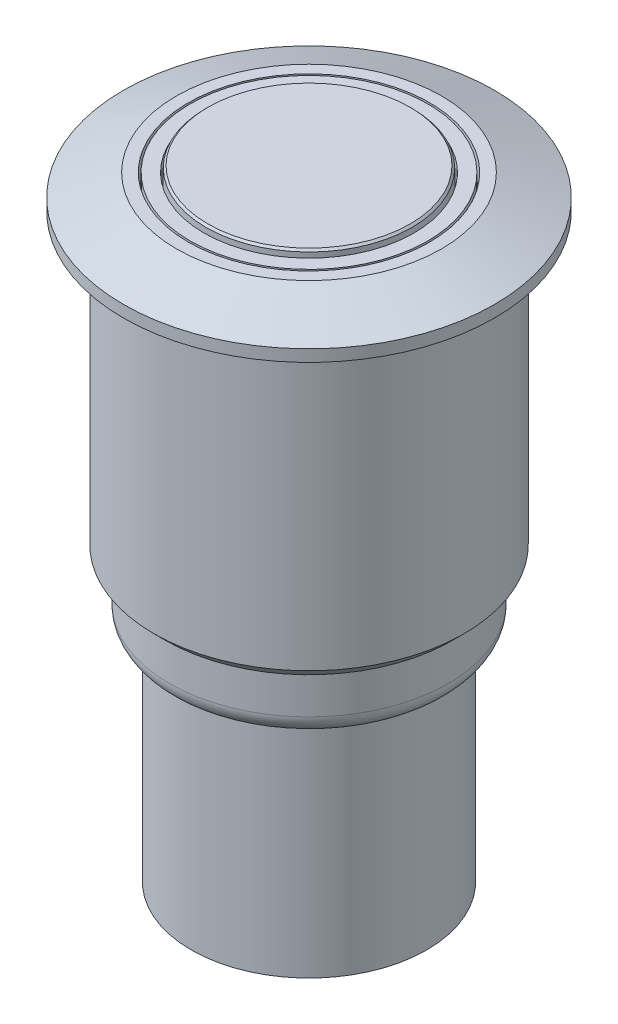
ISO-10303-21;
HEADER;
FILE_DESCRIPTION(('STEP AP214'),'2;1');
FILE_NAME('part.step','',(''),(''),'','','');
FILE_SCHEMA(('AUTOMOTIVE_DESIGN { 1 0 10303 214 1 1 1 1 }'));
ENDSEC;
DATA;
#1=APPLICATION_CONTEXT('core data for automotive mechanical design processes');
#2=APPLICATION_PROTOCOL_DEFINITION('international standard','automotive_design',2000,#1);
#3=PRODUCT_CONTEXT('',#1,'mechanical');
#4=PRODUCT('Part','Part','',(#3));
#5=PRODUCT_RELATED_PRODUCT_CATEGORY('part','',(#4));
#6=PRODUCT_DEFINITION_FORMATION('','',#4);
#7=PRODUCT_DEFINITION_CONTEXT('part definition',#1,'design');
#8=PRODUCT_DEFINITION('design','',#6,#7);
#9=PRODUCT_DEFINITION_SHAPE('','',#8);
#10=(LENGTH_UNIT() NAMED_UNIT(*) SI_UNIT(.MILLI.,.METRE.));
#11=(NAMED_UNIT(*) PLANE_ANGLE_UNIT() SI_UNIT($,.RADIAN.));
#12=(NAMED_UNIT(*) SI_UNIT($,.STERADIAN.) SOLID_ANGLE_UNIT());
#13=UNCERTAINTY_MEASURE_WITH_UNIT(LENGTH_MEASURE(1.E-05),#10,'distance_accuracy_value','');
#14=(GEOMETRIC_REPRESENTATION_CONTEXT(3) GLOBAL_UNCERTAINTY_ASSIGNED_CONTEXT((#13)) GLOBAL_UNIT_ASSIGNED_CONTEXT((#10,
#11,#12)) REPRESENTATION_CONTEXT('',''));
#15=CARTESIAN_POINT('',(0.,0.,0.));
#16=DIRECTION('',(0.,0.,1.));
#17=DIRECTION('',(1.,0.,0.));
#18=AXIS2_PLACEMENT_3D('',#15,#16,#17);
#19=CARTESIAN_POINT('',(0.,2.,0.));
#20=DIRECTION('',(0.,1.,0.));
#21=DIRECTION('',(0.,0.,1.));
#22=AXIS2_PLACEMENT_3D('',#19,#20,#21);
#23=PLANE('',#22);
#24=CARTESIAN_POINT('',(0.,2.00000000000955,0.));
#25=DIRECTION('',(0.,-1.,0.));
#26=DIRECTION('',(1.,0.,0.));
#27=AXIS2_PLACEMENT_3D('',#24,#25,#26);
#28=CIRCLE('',#27,5.15000000007149);
#29=CARTESIAN_POINT('',(5.15000000007149,2.00000000000955,0.));
#30=VERTEX_POINT('',#29);
#31=EDGE_CURVE('E17',#30,#30,#28,.T.);
#32=ORIENTED_EDGE('',*,*,#31,.F.);
#33=EDGE_LOOP('',(#32));
#34=FACE_BOUND('',#33,.T.);
#35=ADVANCED_FACE('F14',(#34),#23,.T.);
#36=CARTESIAN_POINT('',(0.,1.90000000003465,0.));
#37=DIRECTION('',(0.,-1.,0.));
#38=DIRECTION('',(1.,0.,0.));
#39=AXIS2_PLACEMENT_3D('',#36,#37,#38);
#40=CONICAL_SURFACE('',#39,5.24999999998954,0.785398163113231);
#41=ORIENTED_EDGE('',*,*,#31,.T.);
#42=EDGE_LOOP('',(#41));
#43=FACE_BOUND('',#42,.T.);
#44=CARTESIAN_POINT('',(0.,1.90000000000001,0.));
#45=DIRECTION('',(0.,1.,0.));
#46=DIRECTION('',(0.,0.,1.));
#47=AXIS2_PLACEMENT_3D('',#44,#45,#46);
#48=CIRCLE('',#47,5.25);
#49=CARTESIAN_POINT('',(0.,1.90000000000001,5.25));
#50=VERTEX_POINT('',#49);
#51=EDGE_CURVE('E77',#50,#50,#48,.F.);
#52=ORIENTED_EDGE('',*,*,#51,.F.);
#53=EDGE_LOOP('',(#52));
#54=FACE_BOUND('',#53,.T.);
#55=ADVANCED_FACE('F164',(#43,#54),#40,.T.);
#56=CARTESIAN_POINT('',(0.,1.7,0.));
#57=DIRECTION('',(0.,1.,0.));
#58=DIRECTION('',(0.,0.,1.));
#59=AXIS2_PLACEMENT_3D('',#56,#57,#58);
#60=CYLINDRICAL_SURFACE('',#59,5.25);
#61=CARTESIAN_POINT('',(0.,0.6,0.));
#62=DIRECTION('',(0.,1.,0.));
#63=DIRECTION('',(0.,0.,1.));
#64=AXIS2_PLACEMENT_3D('',#61,#62,#63);
#65=CIRCLE('',#64,5.25);
#66=CARTESIAN_POINT('',(0.,0.6,5.25));
#67=VERTEX_POINT('',#66);
#68=EDGE_CURVE('E75',#67,#67,#65,.T.);
#69=ORIENTED_EDGE('',*,*,#68,.T.);
#70=EDGE_LOOP('',(#69));
#71=FACE_BOUND('',#70,.T.);
#72=ORIENTED_EDGE('',*,*,#51,.T.);
#73=EDGE_LOOP('',(#72));
#74=FACE_BOUND('',#73,.T.);
#75=ADVANCED_FACE('F161',(#71,#74),#60,.T.);
#76=CARTESIAN_POINT('',(0.,0.6,5.35));
#77=DIRECTION('',(0.,-1.,0.));
#78=DIRECTION('',(0.,0.,-1.));
#79=AXIS2_PLACEMENT_3D('',#76,#77,#78);
#80=PLANE('',#79);
#81=CARTESIAN_POINT('',(0.,0.6,0.));
#82=DIRECTION('',(0.,1.,0.));
#83=DIRECTION('',(0.,0.,1.));
#84=AXIS2_PLACEMENT_3D('',#81,#82,#83);
#85=CIRCLE('',#84,5.35);
#86=CARTESIAN_POINT('',(0.,0.6,5.35));
#87=VERTEX_POINT('',#86);
#88=EDGE_CURVE('E73',#87,#87,#85,.T.);
#89=ORIENTED_EDGE('',*,*,#88,.T.);
#90=EDGE_LOOP('',(#89));
#91=FACE_BOUND('',#90,.T.);
#92=ORIENTED_EDGE('',*,*,#68,.F.);
#93=EDGE_LOOP('',(#92));
#94=FACE_BOUND('',#93,.T.);
#95=ADVANCED_FACE('F157',(#91,#94),#80,.F.);
#96=CARTESIAN_POINT('',(0.,-26.6,0.));
#97=DIRECTION('',(0.,-1.,0.));
#98=DIRECTION('',(0.,0.,-1.));
#99=AXIS2_PLACEMENT_3D('',#96,#97,#98);
#100=PLANE('',#99);
#101=CARTESIAN_POINT('',(0.,-26.6,0.));
#102=DIRECTION('',(0.,-1.,0.));
#103=DIRECTION('',(0.,0.,-1.));
#104=AXIS2_PLACEMENT_3D('',#101,#102,#103);
#105=CIRCLE('',#104,5.6);
#106=CARTESIAN_POINT('',(0.,-26.6,-5.6));
#107=VERTEX_POINT('',#106);
#108=EDGE_CURVE('E70',#107,#107,#105,.T.);
#109=ORIENTED_EDGE('',*,*,#108,.T.);
#110=EDGE_LOOP('',(#109));
#111=FACE_BOUND('',#110,.T.);
#112=ADVANCED_FACE('F153',(#111),#100,.T.);
#113=CARTESIAN_POINT('',(0.,1.7,0.));
#114=DIRECTION('',(0.,1.,0.));
#115=DIRECTION('',(0.,0.,1.));
#116=AXIS2_PLACEMENT_3D('',#113,#114,#115);
#117=CYLINDRICAL_SURFACE('',#116,5.35);
#118=CARTESIAN_POINT('',(0.,1.7,0.));
#119=DIRECTION('',(0.,1.,0.));
#120=DIRECTION('',(0.,0.,1.));
#121=AXIS2_PLACEMENT_3D('',#118,#119,#120);
#122=CIRCLE('',#121,5.35);
#123=CARTESIAN_POINT('',(0.,1.7,5.35));
#124=VERTEX_POINT('',#123);
#125=EDGE_CURVE('E67',#124,#124,#122,.F.);
#126=ORIENTED_EDGE('',*,*,#125,.F.);
#127=EDGE_LOOP('',(#126));
#128=FACE_BOUND('',#127,.T.);
#129=ORIENTED_EDGE('',*,*,#88,.F.);
#130=EDGE_LOOP('',(#129));
#131=FACE_BOUND('',#130,.T.);
#132=ADVANCED_FACE('F149',(#128,#131),#117,.F.);
#133=CARTESIAN_POINT('',(0.,-26.6,0.));
#134=DIRECTION('',(0.,-1.,0.));
#135=DIRECTION('',(0.,0.,-1.));
#136=AXIS2_PLACEMENT_3D('',#133,#134,#135);
#137=CYLINDRICAL_SURFACE('',#136,5.6);
#138=CARTESIAN_POINT('',(0.,-29.6,0.));
#139=DIRECTION('',(0.,-1.,0.));
#140=DIRECTION('',(0.,0.,-1.));
#141=AXIS2_PLACEMENT_3D('',#138,#139,#140);
#142=CIRCLE('',#141,5.6);
#143=CARTESIAN_POINT('',(0.,-29.6,-5.6));
#144=VERTEX_POINT('',#143);
#145=EDGE_CURVE('E64',#144,#144,#142,.F.);
#146=ORIENTED_EDGE('',*,*,#145,.F.);
#147=EDGE_LOOP('',(#146));
#148=FACE_BOUND('',#147,.T.);
#149=ORIENTED_EDGE('',*,*,#108,.F.);
#150=EDGE_LOOP('',(#149));
#151=FACE_BOUND('',#150,.T.);
#152=ADVANCED_FACE('F145',(#148,#151),#137,.F.);
#153=CARTESIAN_POINT('',(0.,1.7,0.));
#154=DIRECTION('',(0.,1.,0.));
#155=DIRECTION('',(0.,0.,1.));
#156=AXIS2_PLACEMENT_3D('',#153,#154,#155);
#157=PLANE('',#156);
#158=ORIENTED_EDGE('',*,*,#125,.T.);
#159=EDGE_LOOP('',(#158));
#160=FACE_BOUND('',#159,.T.);
#161=CARTESIAN_POINT('',(0.,1.7,0.));
#162=DIRECTION('',(0.,1.,0.));
#163=DIRECTION('',(0.,0.,1.));
#164=AXIS2_PLACEMENT_3D('',#161,#162,#163);
#165=CIRCLE('',#164,6.05);
#166=CARTESIAN_POINT('',(0.,1.7,6.05));
#167=VERTEX_POINT('',#166);
#168=EDGE_CURVE('E61',#167,#167,#165,.F.);
#169=ORIENTED_EDGE('',*,*,#168,.F.);
#170=EDGE_LOOP('',(#169));
#171=FACE_BOUND('',#170,.T.);
#172=ADVANCED_FACE('F141',(#160,#171),#157,.T.);
#173=CARTESIAN_POINT('',(0.,-29.6,0.));
#174=DIRECTION('',(0.,-1.,0.));
#175=DIRECTION('',(0.,0.,-1.));
#176=AXIS2_PLACEMENT_3D('',#173,#174,#175);
#177=PLANE('',#176);
#178=CARTESIAN_POINT('',(0.,-29.6,0.));
#179=DIRECTION('',(0.,1.,0.));
#180=DIRECTION('',(0.,0.,1.));
#181=AXIS2_PLACEMENT_3D('',#178,#179,#180);
#182=CIRCLE('',#181,6.);
#183=CARTESIAN_POINT('',(0.,-29.6,6.));
#184=VERTEX_POINT('',#183);
#185=EDGE_CURVE('E58',#184,#184,#182,.T.);
#186=ORIENTED_EDGE('',*,*,#185,.F.);
#187=EDGE_LOOP('',(#186));
#188=FACE_BOUND('',#187,.T.);
#189=ORIENTED_EDGE('',*,*,#145,.T.);
#190=EDGE_LOOP('',(#189));
#191=FACE_BOUND('',#190,.T.);
#192=ADVANCED_FACE('F137',(#188,#191),#177,.T.);
#193=CARTESIAN_POINT('',(0.,1.7,0.));
#194=DIRECTION('',(0.,1.,0.));
#195=DIRECTION('',(0.,0.,1.));
#196=AXIS2_PLACEMENT_3D('',#193,#194,#195);
#197=CYLINDRICAL_SURFACE('',#196,6.05);
#198=CARTESIAN_POINT('',(0.,0.6,0.));
#199=DIRECTION('',(0.,1.,0.));
#200=DIRECTION('',(0.,0.,1.));
#201=AXIS2_PLACEMENT_3D('',#198,#199,#200);
#202=CIRCLE('',#201,6.05);
#203=CARTESIAN_POINT('',(0.,0.6,6.05));
#204=VERTEX_POINT('',#203);
#205=EDGE_CURVE('E55',#204,#204,#202,.T.);
#206=ORIENTED_EDGE('',*,*,#205,.T.);
#207=EDGE_LOOP('',(#206));
#208=FACE_BOUND('',#207,.T.);
#209=ORIENTED_EDGE('',*,*,#168,.T.);
#210=EDGE_LOOP('',(#209));
#211=FACE_BOUND('',#210,.T.);
#212=ADVANCED_FACE('F133',(#208,#211),#197,.T.);
#213=CARTESIAN_POINT('',(0.,-29.6,0.));
#214=DIRECTION('',(0.,1.,0.));
#215=DIRECTION('',(0.,0.,1.));
#216=AXIS2_PLACEMENT_3D('',#213,#214,#215);
#217=CYLINDRICAL_SURFACE('',#216,6.);
#218=CARTESIAN_POINT('',(0.,-18.3,0.));
#219=DIRECTION('',(0.,1.,0.));
#220=DIRECTION('',(0.,0.,1.));
#221=AXIS2_PLACEMENT_3D('',#218,#219,#220);
#222=CIRCLE('',#221,6.);
#223=CARTESIAN_POINT('',(0.,-18.3,6.));
#224=VERTEX_POINT('',#223);
#225=EDGE_CURVE('E52',#224,#224,#222,.T.);
#226=ORIENTED_EDGE('',*,*,#225,.F.);
#227=EDGE_LOOP('',(#226));
#228=FACE_BOUND('',#227,.T.);
#229=ORIENTED_EDGE('',*,*,#185,.T.);
#230=EDGE_LOOP('',(#229));
#231=FACE_BOUND('',#230,.T.);
#232=ADVANCED_FACE('F129',(#228,#231),#217,.T.);
#233=CARTESIAN_POINT('',(0.,0.6,6.15));
#234=DIRECTION('',(0.,-1.,0.));
#235=DIRECTION('',(0.,0.,-1.));
#236=AXIS2_PLACEMENT_3D('',#233,#234,#235);
#237=PLANE('',#236);
#238=CARTESIAN_POINT('',(0.,0.6,0.));
#239=DIRECTION('',(0.,1.,0.));
#240=DIRECTION('',(0.,0.,1.));
#241=AXIS2_PLACEMENT_3D('',#238,#239,#240);
#242=CIRCLE('',#241,6.15);
#243=CARTESIAN_POINT('',(0.,0.6,6.15));
#244=VERTEX_POINT('',#243);
#245=EDGE_CURVE('E49',#244,#244,#242,.T.);
#246=ORIENTED_EDGE('',*,*,#245,.T.);
#247=EDGE_LOOP('',(#246));
#248=FACE_BOUND('',#247,.T.);
#249=ORIENTED_EDGE('',*,*,#205,.F.);
#250=EDGE_LOOP('',(#249));
#251=FACE_BOUND('',#250,.T.);
#252=ADVANCED_FACE('F125',(#248,#251),#237,.F.);
#253=CARTESIAN_POINT('',(0.,-18.3,0.));
#254=DIRECTION('',(0.,-1.,0.));
#255=DIRECTION('',(0.,0.,-1.));
#256=AXIS2_PLACEMENT_3D('',#253,#254,#255);
#257=PLANE('',#256);
#258=ORIENTED_EDGE('',*,*,#225,.T.);
#259=EDGE_LOOP('',(#258));
#260=FACE_BOUND('',#259,.T.);
#261=CARTESIAN_POINT('',(0.,-18.3,0.));
#262=DIRECTION('',(0.,1.,0.));
#263=DIRECTION('',(0.,0.,-1.));
#264=AXIS2_PLACEMENT_3D('',#261,#262,#263);
#265=CIRCLE('',#264,6.1);
#266=CARTESIAN_POINT('',(0.,-18.3,-6.1));
#267=VERTEX_POINT('',#266);
#268=EDGE_CURVE('E48',#267,#267,#265,.T.);
#269=ORIENTED_EDGE('',*,*,#268,.F.);
#270=EDGE_LOOP('',(#269));
#271=FACE_BOUND('',#270,.T.);
#272=ADVANCED_FACE('F116',(#260,#271),#257,.T.);
#273=CARTESIAN_POINT('',(0.,1.7,0.));
#274=DIRECTION('',(0.,1.,0.));
#275=DIRECTION('',(0.,0.,1.));
#276=AXIS2_PLACEMENT_3D('',#273,#274,#275);
#277=CYLINDRICAL_SURFACE('',#276,6.15);
#278=CARTESIAN_POINT('',(0.,1.7,0.));
#279=DIRECTION('',(0.,1.,0.));
#280=DIRECTION('',(0.,0.,1.));
#281=AXIS2_PLACEMENT_3D('',#278,#279,#280);
#282=CIRCLE('',#281,6.15);
#283=CARTESIAN_POINT('',(0.,1.7,6.15));
#284=VERTEX_POINT('',#283);
#285=EDGE_CURVE('E45',#284,#284,#282,.F.);
#286=ORIENTED_EDGE('',*,*,#285,.F.);
#287=EDGE_LOOP('',(#286));
#288=FACE_BOUND('',#287,.T.);
#289=ORIENTED_EDGE('',*,*,#245,.F.);
#290=EDGE_LOOP('',(#289));
#291=FACE_BOUND('',#290,.T.);
#292=ADVANCED_FACE('F103',(#288,#291),#277,.F.);
#293=CARTESIAN_POINT('',(0.,-17.3,0.));
#294=DIRECTION('',(0.,-1.,0.));
#295=DIRECTION('',(0.,0.,-1.));
#296=AXIS2_PLACEMENT_3D('',#293,#294,#295);
#297=TOROIDAL_SURFACE('',#296,6.1,1.);
#298=ORIENTED_EDGE('',*,*,#268,.T.);
#299=EDGE_LOOP('',(#298));
#300=FACE_BOUND('',#299,.T.);
#301=CARTESIAN_POINT('',(0.,-17.3,0.));
#302=DIRECTION('',(0.,-1.,0.));
#303=DIRECTION('',(0.,0.,-1.));
#304=AXIS2_PLACEMENT_3D('',#301,#302,#303);
#305=CIRCLE('',#304,7.1);
#306=CARTESIAN_POINT('',(0.,-17.3,-7.1));
#307=VERTEX_POINT('',#306);
#308=EDGE_CURVE('E44',#307,#307,#305,.F.);
#309=ORIENTED_EDGE('',*,*,#308,.F.);
#310=EDGE_LOOP('',(#309));
#311=FACE_BOUND('',#310,.T.);
#312=ADVANCED_FACE('F91',(#300,#311),#297,.T.);
#313=CARTESIAN_POINT('',(0.,1.7,0.));
#314=DIRECTION('',(0.,1.,0.));
#315=DIRECTION('',(0.,0.,1.));
#316=AXIS2_PLACEMENT_3D('',#313,#314,#315);
#317=PLANE('',#316);
#318=ORIENTED_EDGE('',*,*,#285,.T.);
#319=EDGE_LOOP('',(#318));
#320=FACE_BOUND('',#319,.T.);
#321=CARTESIAN_POINT('',(0.,1.7,0.));
#322=DIRECTION('',(0.,-1.,0.));
#323=DIRECTION('',(0.,0.,-1.));
#324=AXIS2_PLACEMENT_3D('',#321,#322,#323);
#325=CIRCLE('',#324,6.75);
#326=CARTESIAN_POINT('',(0.,1.7,-6.75));
#327=VERTEX_POINT('',#326);
#328=EDGE_CURVE('E41',#327,#327,#325,.T.);
#329=ORIENTED_EDGE('',*,*,#328,.F.);
#330=EDGE_LOOP('',(#329));
#331=FACE_BOUND('',#330,.T.);
#332=ADVANCED_FACE('F102',(#320,#331),#317,.T.);
#333=CARTESIAN_POINT('',(0.,-15.3,0.));
#334=DIRECTION('',(0.,-1.,0.));
#335=DIRECTION('',(0.,0.,-1.));
#336=AXIS2_PLACEMENT_3D('',#333,#334,#335);
#337=CYLINDRICAL_SURFACE('',#336,7.1);
#338=CARTESIAN_POINT('',(0.,-15.3,0.));
#339=DIRECTION('',(0.,-1.,0.));
#340=DIRECTION('',(0.,0.,-1.));
#341=AXIS2_PLACEMENT_3D('',#338,#339,#340);
#342=CIRCLE('',#341,7.1);
#343=CARTESIAN_POINT('',(0.,-15.3,-7.1));
#344=VERTEX_POINT('',#343);
#345=EDGE_CURVE('E38',#344,#344,#342,.F.);
#346=ORIENTED_EDGE('',*,*,#345,.F.);
#347=EDGE_LOOP('',(#346));
#348=FACE_BOUND('',#347,.T.);
#349=ORIENTED_EDGE('',*,*,#308,.T.);
#350=EDGE_LOOP('',(#349));
#351=FACE_BOUND('',#350,.T.);
#352=ADVANCED_FACE('F199',(#348,#351),#337,.T.);
#353=CARTESIAN_POINT('',(0.,0.6,0.));
#354=DIRECTION('',(0.,-1.,0.));
#355=DIRECTION('',(0.,0.,-1.));
#356=AXIS2_PLACEMENT_3D('',#353,#354,#355);
#357=CONICAL_SURFACE('',#356,9.45,1.18392060906387);
#358=CARTESIAN_POINT('',(0.,0.6,0.));
#359=DIRECTION('',(0.,-1.,0.));
#360=DIRECTION('',(0.,0.,-1.));
#361=AXIS2_PLACEMENT_3D('',#358,#359,#360);
#362=CIRCLE('',#361,9.45);
#363=CARTESIAN_POINT('',(0.,0.6,-9.45));
#364=VERTEX_POINT('',#363);
#365=EDGE_CURVE('E37',#364,#364,#362,.T.);
#366=ORIENTED_EDGE('',*,*,#365,.F.);
#367=EDGE_LOOP('',(#366));
#368=FACE_BOUND('',#367,.T.);
#369=ORIENTED_EDGE('',*,*,#328,.T.);
#370=EDGE_LOOP('',(#369));
#371=FACE_BOUND('',#370,.T.);
#372=ADVANCED_FACE('F196',(#368,#371),#357,.T.);
#373=CARTESIAN_POINT('',(0.,-15.3,0.));
#374=DIRECTION('',(0.,-1.,0.));
#375=DIRECTION('',(0.,0.,-1.));
#376=AXIS2_PLACEMENT_3D('',#373,#374,#375);
#377=PLANE('',#376);
#378=ORIENTED_EDGE('',*,*,#345,.T.);
#379=EDGE_LOOP('',(#378));
#380=FACE_BOUND('',#379,.T.);
#381=CARTESIAN_POINT('',(0.,-15.3,0.));
#382=DIRECTION('',(0.,1.,0.));
#383=DIRECTION('',(0.,0.,1.));
#384=AXIS2_PLACEMENT_3D('',#381,#382,#383);
#385=CIRCLE('',#384,7.3);
#386=CARTESIAN_POINT('',(0.,-15.3,7.3));
#387=VERTEX_POINT('',#386);
#388=EDGE_CURVE('E34',#387,#387,#385,.T.);
#389=ORIENTED_EDGE('',*,*,#388,.F.);
#390=EDGE_LOOP('',(#389));
#391=FACE_BOUND('',#390,.T.);
#392=ADVANCED_FACE('F192',(#380,#391),#377,.T.);
#393=CARTESIAN_POINT('',(0.,1.7,0.));
#394=DIRECTION('',(0.,-1.,0.));
#395=DIRECTION('',(0.,0.,-1.));
#396=AXIS2_PLACEMENT_3D('',#393,#394,#395);
#397=CYLINDRICAL_SURFACE('',#396,9.45);
#398=CARTESIAN_POINT('',(0.,0.,0.));
#399=DIRECTION('',(0.,-1.,0.));
#400=DIRECTION('',(0.,0.,-1.));
#401=AXIS2_PLACEMENT_3D('',#398,#399,#400);
#402=CIRCLE('',#401,9.45);
#403=CARTESIAN_POINT('',(0.,0.,-9.45));
#404=VERTEX_POINT('',#403);
#405=EDGE_CURVE('E26',#404,#404,#402,.F.);
#406=ORIENTED_EDGE('',*,*,#405,.T.);
#407=EDGE_LOOP('',(#406));
#408=FACE_BOUND('',#407,.T.);
#409=ORIENTED_EDGE('',*,*,#365,.T.);
#410=EDGE_LOOP('',(#409));
#411=FACE_BOUND('',#410,.T.);
#412=ADVANCED_FACE('F188',(#408,#411),#397,.T.);
#413=CARTESIAN_POINT('',(0.,-14.7,0.));
#414=DIRECTION('',(0.,1.,0.));
#415=DIRECTION('',(0.,0.,1.));
#416=AXIS2_PLACEMENT_3D('',#413,#414,#415);
#417=CONICAL_SURFACE('',#416,7.9,0.785398163397448);
#418=ORIENTED_EDGE('',*,*,#388,.T.);
#419=EDGE_LOOP('',(#418));
#420=FACE_BOUND('',#419,.T.);
#421=CARTESIAN_POINT('',(0.,-14.7,0.));
#422=DIRECTION('',(0.,1.,0.));
#423=DIRECTION('',(0.,0.,1.));
#424=AXIS2_PLACEMENT_3D('',#421,#422,#423);
#425=CIRCLE('',#424,7.9);
#426=CARTESIAN_POINT('',(0.,-14.7,7.9));
#427=VERTEX_POINT('',#426);
#428=EDGE_CURVE('E21',#427,#427,#425,.T.);
#429=ORIENTED_EDGE('',*,*,#428,.F.);
#430=EDGE_LOOP('',(#429));
#431=FACE_BOUND('',#430,.T.);
#432=ADVANCED_FACE('F181',(#420,#431),#417,.T.);
#433=CARTESIAN_POINT('',(0.,0.,0.));
#434=DIRECTION('',(0.,1.,0.));
#435=DIRECTION('',(0.,0.,1.));
#436=AXIS2_PLACEMENT_3D('',#433,#434,#435);
#437=PLANE('',#436);
#438=CARTESIAN_POINT('',(0.,0.,0.));
#439=DIRECTION('',(0.,1.,0.));
#440=DIRECTION('',(0.,0.,1.));
#441=AXIS2_PLACEMENT_3D('',#438,#439,#440);
#442=CIRCLE('',#441,7.9);
#443=CARTESIAN_POINT('',(0.,0.,7.9));
#444=VERTEX_POINT('',#443);
#445=EDGE_CURVE('E10',#444,#444,#442,.F.);
#446=ORIENTED_EDGE('',*,*,#445,.F.);
#447=EDGE_LOOP('',(#446));
#448=FACE_BOUND('',#447,.T.);
#449=ORIENTED_EDGE('',*,*,#405,.F.);
#450=EDGE_LOOP('',(#449));
#451=FACE_BOUND('',#450,.T.);
#452=ADVANCED_FACE('F176',(#448,#451),#437,.F.);
#453=CARTESIAN_POINT('',(0.,-18.3,0.));
#454=DIRECTION('',(0.,1.,0.));
#455=DIRECTION('',(0.,0.,1.));
#456=AXIS2_PLACEMENT_3D('',#453,#454,#455);
#457=CYLINDRICAL_SURFACE('',#456,7.9);
#458=ORIENTED_EDGE('',*,*,#445,.T.);
#459=EDGE_LOOP('',(#458));
#460=FACE_BOUND('',#459,.T.);
#461=ORIENTED_EDGE('',*,*,#428,.T.);
#462=EDGE_LOOP('',(#461));
#463=FACE_BOUND('',#462,.T.);
#464=ADVANCED_FACE('F174',(#460,#463),#457,.T.);
#465=CLOSED_SHELL('',(#35,#55,#75,#95,#112,#132,#152,#172,#192,#212,#232,#252,#272,#292,#312,
#332,#352,#372,#392,#412,#432,#452,#464));
#466=MANIFOLD_SOLID_BREP('B1',#465);
#467=ADVANCED_BREP_SHAPE_REPRESENTATION('',(#18,#466),#14);
#468=SHAPE_DEFINITION_REPRESENTATION(#9,#467);
ENDSEC;
END-ISO-10303-21;
